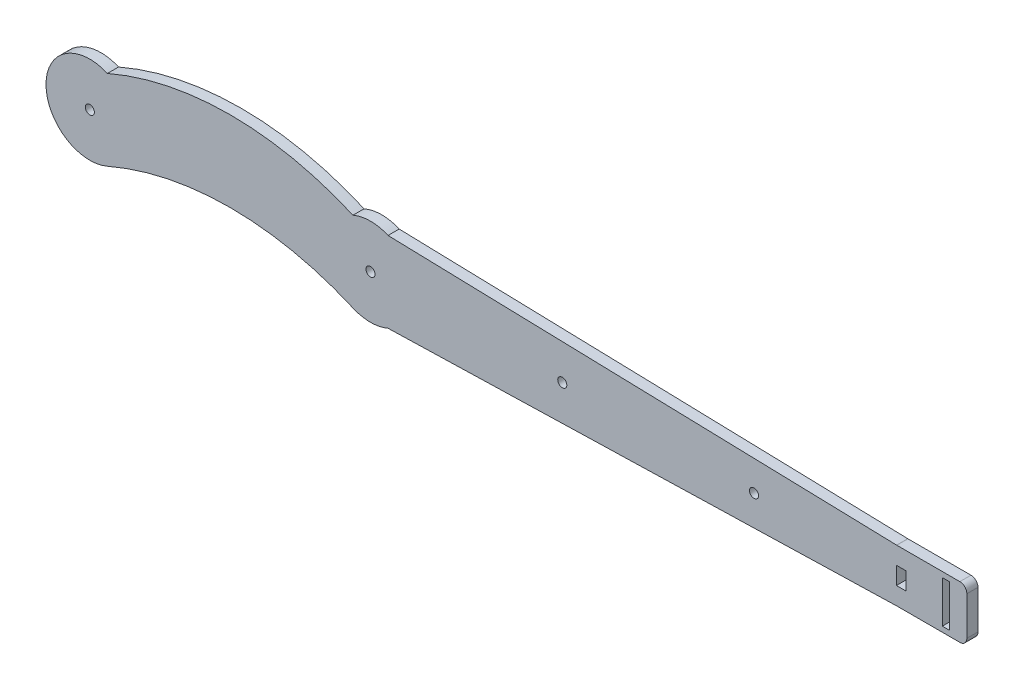
ISO-10303-21;
HEADER;
FILE_DESCRIPTION(('STEP AP214'),'2;1');
FILE_NAME('part.step','',(''),(''),'','','');
FILE_SCHEMA(('AUTOMOTIVE_DESIGN { 1 0 10303 214 1 1 1 1 }'));
ENDSEC;
DATA;
#1=APPLICATION_CONTEXT('core data for automotive mechanical design processes');
#2=APPLICATION_PROTOCOL_DEFINITION('international standard','automotive_design',2000,#1);
#3=PRODUCT_CONTEXT('',#1,'mechanical');
#4=PRODUCT('Part','Part','',(#3));
#5=PRODUCT_RELATED_PRODUCT_CATEGORY('part','',(#4));
#6=PRODUCT_DEFINITION_FORMATION('','',#4);
#7=PRODUCT_DEFINITION_CONTEXT('part definition',#1,'design');
#8=PRODUCT_DEFINITION('design','',#6,#7);
#9=PRODUCT_DEFINITION_SHAPE('','',#8);
#10=(LENGTH_UNIT() NAMED_UNIT(*) SI_UNIT(.MILLI.,.METRE.));
#11=(NAMED_UNIT(*) PLANE_ANGLE_UNIT() SI_UNIT($,.RADIAN.));
#12=(NAMED_UNIT(*) SI_UNIT($,.STERADIAN.) SOLID_ANGLE_UNIT());
#13=UNCERTAINTY_MEASURE_WITH_UNIT(LENGTH_MEASURE(1.E-05),#10,'distance_accuracy_value','');
#14=(GEOMETRIC_REPRESENTATION_CONTEXT(3) GLOBAL_UNCERTAINTY_ASSIGNED_CONTEXT((#13)) GLOBAL_UNIT_ASSIGNED_CONTEXT((#10,
#11,#12)) REPRESENTATION_CONTEXT('',''));
#15=CARTESIAN_POINT('',(0.,0.,0.));
#16=DIRECTION('',(0.,0.,1.));
#17=DIRECTION('',(1.,0.,0.));
#18=AXIS2_PLACEMENT_3D('',#15,#16,#17);
#19=CARTESIAN_POINT('',(150.,7.5,3.175));
#20=DIRECTION('',(0.,-1.,0.));
#21=DIRECTION('',(0.,0.,-1.));
#22=AXIS2_PLACEMENT_3D('',#19,#20,#21);
#23=PLANE('',#22);
#24=DIRECTION('',(-1.,0.,0.));
#25=VECTOR('',#24,1.);
#26=CARTESIAN_POINT('',(150.,7.5,0.));
#27=LINE('',#26,#25);
#28=CARTESIAN_POINT('',(168.,7.5,0.));
#29=VERTEX_POINT('',#28);
#30=CARTESIAN_POINT('',(150.027280711069,7.5,0.));
#31=VERTEX_POINT('',#30);
#32=EDGE_CURVE('E310',#29,#31,#27,.T.);
#33=ORIENTED_EDGE('',*,*,#32,.T.);
#34=DIRECTION('',(0.,0.,-1.));
#35=VECTOR('',#34,1.);
#36=CARTESIAN_POINT('',(150.027280711069,7.5,3.175));
#37=LINE('',#36,#35);
#38=CARTESIAN_POINT('',(150.027280711069,7.5,3.175));
#39=VERTEX_POINT('',#38);
#40=EDGE_CURVE('E363',#31,#39,#37,.F.);
#41=ORIENTED_EDGE('',*,*,#40,.T.);
#42=DIRECTION('',(-1.,0.,0.));
#43=VECTOR('',#42,1.);
#44=CARTESIAN_POINT('',(150.,7.5,3.175));
#45=LINE('',#44,#43);
#46=CARTESIAN_POINT('',(168.,7.5,3.175));
#47=VERTEX_POINT('',#46);
#48=EDGE_CURVE('E286',#47,#39,#45,.T.);
#49=ORIENTED_EDGE('',*,*,#48,.F.);
#50=DIRECTION('',(0.,0.,-1.));
#51=VECTOR('',#50,1.);
#52=CARTESIAN_POINT('',(168.,7.5,3.175));
#53=LINE('',#52,#51);
#54=EDGE_CURVE('E360',#47,#29,#53,.T.);
#55=ORIENTED_EDGE('',*,*,#54,.T.);
#56=EDGE_LOOP('',(#33,#41,#49,#55));
#57=FACE_BOUND('',#56,.T.);
#58=ADVANCED_FACE('F44',(#57),#23,.F.);
#59=CARTESIAN_POINT('',(150.,7.5,3.175));
#60=DIRECTION('',(-0.0272756361837529,-0.999627950625017,0.));
#61=DIRECTION('',(0.999627950625017,-0.0272756361837529,0.));
#62=AXIS2_PLACEMENT_3D('',#59,#60,#61);
#63=PLANE('',#62);
#64=DIRECTION('',(-0.999627950625017,0.0272756361837529,0.));
#65=VECTOR('',#64,1.);
#66=CARTESIAN_POINT('',(150.,7.5,3.175));
#67=LINE('',#66,#65);
#68=CARTESIAN_POINT('',(149.972729438702,7.50074409874996,3.175));
#69=VERTEX_POINT('',#68);
#70=CARTESIAN_POINT('',(5.,11.4564392373896,3.175));
#71=VERTEX_POINT('',#70);
#72=EDGE_CURVE('E289',#69,#71,#67,.T.);
#73=ORIENTED_EDGE('',*,*,#72,.F.);
#74=DIRECTION('',(0.,0.,-1.));
#75=VECTOR('',#74,1.);
#76=CARTESIAN_POINT('',(149.972729438702,7.50074409874996,0.));
#77=LINE('',#76,#75);
#78=CARTESIAN_POINT('',(149.972729438702,7.50074409874996,0.));
#79=VERTEX_POINT('',#78);
#80=EDGE_CURVE('E357',#69,#79,#77,.T.);
#81=ORIENTED_EDGE('',*,*,#80,.T.);
#82=DIRECTION('',(-0.999627950625017,0.0272756361837529,0.));
#83=VECTOR('',#82,1.);
#84=CARTESIAN_POINT('',(150.,7.5,0.));
#85=LINE('',#84,#83);
#86=CARTESIAN_POINT('',(5.,11.4564392373896,0.));
#87=VERTEX_POINT('',#86);
#88=EDGE_CURVE('E313',#79,#87,#85,.T.);
#89=ORIENTED_EDGE('',*,*,#88,.T.);
#90=DIRECTION('',(0.,0.,-1.));
#91=VECTOR('',#90,1.);
#92=CARTESIAN_POINT('',(5.,11.4564392373896,3.175));
#93=LINE('',#92,#91);
#94=EDGE_CURVE('E347',#71,#87,#93,.T.);
#95=ORIENTED_EDGE('',*,*,#94,.F.);
#96=EDGE_LOOP('',(#73,#81,#89,#95));
#97=FACE_BOUND('',#96,.T.);
#98=ADVANCED_FACE('F396',(#97),#63,.F.);
#99=CARTESIAN_POINT('',(0.,0.,3.175));
#100=DIRECTION('',(0.,0.,-1.));
#101=DIRECTION('',(-1.,0.,0.));
#102=AXIS2_PLACEMENT_3D('',#99,#100,#101);
#103=CYLINDRICAL_SURFACE('',#102,12.5);
#104=CARTESIAN_POINT('',(0.,0.,0.));
#105=DIRECTION('',(0.,0.,1.));
#106=DIRECTION('',(1.,0.,0.));
#107=AXIS2_PLACEMENT_3D('',#104,#105,#106);
#108=CIRCLE('',#107,12.5);
#109=CARTESIAN_POINT('',(-5.,11.4564392373896,0.));
#110=VERTEX_POINT('',#109);
#111=EDGE_CURVE('E316',#87,#110,#108,.T.);
#112=ORIENTED_EDGE('',*,*,#111,.T.);
#113=DIRECTION('',(0.,0.,-1.));
#114=VECTOR('',#113,1.);
#115=CARTESIAN_POINT('',(-5.,11.4564392373896,3.175));
#116=LINE('',#115,#114);
#117=CARTESIAN_POINT('',(-5.,11.4564392373896,3.175));
#118=VERTEX_POINT('',#117);
#119=EDGE_CURVE('E344',#118,#110,#116,.T.);
#120=ORIENTED_EDGE('',*,*,#119,.F.);
#121=CARTESIAN_POINT('',(0.,0.,3.175));
#122=DIRECTION('',(0.,0.,1.));
#123=DIRECTION('',(1.,0.,0.));
#124=AXIS2_PLACEMENT_3D('',#121,#122,#123);
#125=CIRCLE('',#124,12.5);
#126=EDGE_CURVE('E292',#71,#118,#125,.T.);
#127=ORIENTED_EDGE('',*,*,#126,.F.);
#128=ORIENTED_EDGE('',*,*,#94,.T.);
#129=EDGE_LOOP('',(#112,#120,#127,#128));
#130=FACE_BOUND('',#129,.T.);
#131=ADVANCED_FACE('F400',(#130),#103,.T.);
#132=CARTESIAN_POINT('',(-40.,-68.7386354243369,3.175));
#133=DIRECTION('',(0.,0.,-1.));
#134=DIRECTION('',(-1.,0.,0.));
#135=AXIS2_PLACEMENT_3D('',#132,#133,#134);
#136=CYLINDRICAL_SURFACE('',#135,87.4999999999994);
#137=CARTESIAN_POINT('',(-40.,-68.7386354243369,0.));
#138=DIRECTION('',(0.,0.,1.));
#139=DIRECTION('',(1.,0.,0.));
#140=AXIS2_PLACEMENT_3D('',#137,#138,#139);
#141=CIRCLE('',#140,87.4999999999994);
#142=CARTESIAN_POINT('',(-75.,11.4564392373896,0.));
#143=VERTEX_POINT('',#142);
#144=EDGE_CURVE('E318',#110,#143,#141,.T.);
#145=ORIENTED_EDGE('',*,*,#144,.T.);
#146=DIRECTION('',(0.,0.,-1.));
#147=VECTOR('',#146,1.);
#148=CARTESIAN_POINT('',(-75.,11.4564392373896,3.175));
#149=LINE('',#148,#147);
#150=CARTESIAN_POINT('',(-75.,11.4564392373896,3.175));
#151=VERTEX_POINT('',#150);
#152=EDGE_CURVE('E341',#151,#143,#149,.T.);
#153=ORIENTED_EDGE('',*,*,#152,.F.);
#154=CARTESIAN_POINT('',(-40.,-68.7386354243369,3.175));
#155=DIRECTION('',(0.,0.,1.));
#156=DIRECTION('',(1.,0.,0.));
#157=AXIS2_PLACEMENT_3D('',#154,#155,#156);
#158=CIRCLE('',#157,87.4999999999994);
#159=EDGE_CURVE('E294',#118,#151,#158,.T.);
#160=ORIENTED_EDGE('',*,*,#159,.F.);
#161=ORIENTED_EDGE('',*,*,#119,.T.);
#162=EDGE_LOOP('',(#145,#153,#160,#161));
#163=FACE_BOUND('',#162,.T.);
#164=ADVANCED_FACE('F406',(#163),#136,.T.);
#165=CARTESIAN_POINT('',(-80.,0.,3.175));
#166=DIRECTION('',(0.,0.,-1.));
#167=DIRECTION('',(-1.,0.,0.));
#168=AXIS2_PLACEMENT_3D('',#165,#166,#167);
#169=CYLINDRICAL_SURFACE('',#168,12.5);
#170=CARTESIAN_POINT('',(-80.,0.,0.));
#171=DIRECTION('',(0.,0.,1.));
#172=DIRECTION('',(1.,0.,0.));
#173=AXIS2_PLACEMENT_3D('',#170,#171,#172);
#174=CIRCLE('',#173,12.5);
#175=CARTESIAN_POINT('',(-75.,-11.4564392373896,0.));
#176=VERTEX_POINT('',#175);
#177=EDGE_CURVE('E320',#143,#176,#174,.T.);
#178=ORIENTED_EDGE('',*,*,#177,.T.);
#179=DIRECTION('',(0.,0.,-1.));
#180=VECTOR('',#179,1.);
#181=CARTESIAN_POINT('',(-75.,-11.4564392373896,3.175));
#182=LINE('',#181,#180);
#183=CARTESIAN_POINT('',(-75.,-11.4564392373896,3.175));
#184=VERTEX_POINT('',#183);
#185=EDGE_CURVE('E338',#184,#176,#182,.T.);
#186=ORIENTED_EDGE('',*,*,#185,.F.);
#187=CARTESIAN_POINT('',(-80.,0.,3.175));
#188=DIRECTION('',(0.,0.,1.));
#189=DIRECTION('',(1.,0.,0.));
#190=AXIS2_PLACEMENT_3D('',#187,#188,#189);
#191=CIRCLE('',#190,12.5);
#192=EDGE_CURVE('E296',#151,#184,#191,.T.);
#193=ORIENTED_EDGE('',*,*,#192,.F.);
#194=ORIENTED_EDGE('',*,*,#152,.T.);
#195=EDGE_LOOP('',(#178,#186,#193,#194));
#196=FACE_BOUND('',#195,.T.);
#197=ADVANCED_FACE('F410',(#196),#169,.T.);
#198=CARTESIAN_POINT('',(-40.,-91.6515138991167,3.175));
#199=DIRECTION('',(0.,0.,-1.));
#200=DIRECTION('',(-1.,0.,0.));
#201=AXIS2_PLACEMENT_3D('',#198,#199,#200);
#202=CYLINDRICAL_SURFACE('',#201,87.4999999999999);
#203=CARTESIAN_POINT('',(-40.,-91.6515138991167,0.));
#204=DIRECTION('',(0.,0.,-1.));
#205=DIRECTION('',(1.,0.,0.));
#206=AXIS2_PLACEMENT_3D('',#203,#204,#205);
#207=CIRCLE('',#206,87.4999999999999);
#208=CARTESIAN_POINT('',(-5.00000000000001,-11.4564392373896,0.));
#209=VERTEX_POINT('',#208);
#210=EDGE_CURVE('E322',#176,#209,#207,.T.);
#211=ORIENTED_EDGE('',*,*,#210,.T.);
#212=DIRECTION('',(0.,0.,-1.));
#213=VECTOR('',#212,1.);
#214=CARTESIAN_POINT('',(-5.00000000000001,-11.4564392373896,3.175));
#215=LINE('',#214,#213);
#216=CARTESIAN_POINT('',(-5.00000000000001,-11.4564392373896,3.175));
#217=VERTEX_POINT('',#216);
#218=EDGE_CURVE('E335',#217,#209,#215,.T.);
#219=ORIENTED_EDGE('',*,*,#218,.F.);
#220=CARTESIAN_POINT('',(-40.,-91.6515138991167,3.175));
#221=DIRECTION('',(0.,0.,-1.));
#222=DIRECTION('',(1.,0.,0.));
#223=AXIS2_PLACEMENT_3D('',#220,#221,#222);
#224=CIRCLE('',#223,87.4999999999999);
#225=EDGE_CURVE('E298',#184,#217,#224,.T.);
#226=ORIENTED_EDGE('',*,*,#225,.F.);
#227=ORIENTED_EDGE('',*,*,#185,.T.);
#228=EDGE_LOOP('',(#211,#219,#226,#227));
#229=FACE_BOUND('',#228,.T.);
#230=ADVANCED_FACE('F415',(#229),#202,.F.);
#231=CARTESIAN_POINT('',(0.,0.,3.175));
#232=DIRECTION('',(0.,0.,-1.));
#233=DIRECTION('',(-1.,0.,0.));
#234=AXIS2_PLACEMENT_3D('',#231,#232,#233);
#235=CYLINDRICAL_SURFACE('',#234,12.5);
#236=CARTESIAN_POINT('',(0.,0.,0.));
#237=DIRECTION('',(0.,0.,1.));
#238=DIRECTION('',(1.,0.,0.));
#239=AXIS2_PLACEMENT_3D('',#236,#237,#238);
#240=CIRCLE('',#239,12.5);
#241=CARTESIAN_POINT('',(5.,-11.4564392373896,0.));
#242=VERTEX_POINT('',#241);
#243=EDGE_CURVE('E324',#209,#242,#240,.T.);
#244=ORIENTED_EDGE('',*,*,#243,.T.);
#245=DIRECTION('',(0.,0.,-1.));
#246=VECTOR('',#245,1.);
#247=CARTESIAN_POINT('',(5.,-11.4564392373896,3.175));
#248=LINE('',#247,#246);
#249=CARTESIAN_POINT('',(5.,-11.4564392373896,3.175));
#250=VERTEX_POINT('',#249);
#251=EDGE_CURVE('E309',#250,#242,#248,.T.);
#252=ORIENTED_EDGE('',*,*,#251,.F.);
#253=CARTESIAN_POINT('',(0.,0.,3.175));
#254=DIRECTION('',(0.,0.,1.));
#255=DIRECTION('',(1.,0.,0.));
#256=AXIS2_PLACEMENT_3D('',#253,#254,#255);
#257=CIRCLE('',#256,12.5);
#258=EDGE_CURVE('E300',#217,#250,#257,.T.);
#259=ORIENTED_EDGE('',*,*,#258,.F.);
#260=ORIENTED_EDGE('',*,*,#218,.T.);
#261=EDGE_LOOP('',(#244,#252,#259,#260));
#262=FACE_BOUND('',#261,.T.);
#263=ADVANCED_FACE('F421',(#262),#235,.T.);
#264=CARTESIAN_POINT('',(5.,-11.4564392373896,3.175));
#265=DIRECTION('',(-0.0272756361837529,0.999627950625017,0.));
#266=DIRECTION('',(-0.999627950625017,-0.0272756361837529,0.));
#267=AXIS2_PLACEMENT_3D('',#264,#265,#266);
#268=PLANE('',#267);
#269=DIRECTION('',(0.999627950625017,0.0272756361837529,0.));
#270=VECTOR('',#269,1.);
#271=CARTESIAN_POINT('',(5.,-11.4564392373896,0.));
#272=LINE('',#271,#270);
#273=CARTESIAN_POINT('',(149.972729438702,-7.50074409874997,0.));
#274=VERTEX_POINT('',#273);
#275=EDGE_CURVE('E326',#242,#274,#272,.T.);
#276=ORIENTED_EDGE('',*,*,#275,.T.);
#277=DIRECTION('',(0.,0.,-1.));
#278=VECTOR('',#277,1.);
#279=CARTESIAN_POINT('',(149.972729438702,-7.50074409874996,3.175));
#280=LINE('',#279,#278);
#281=CARTESIAN_POINT('',(149.972729438702,-7.50074409874997,3.175));
#282=VERTEX_POINT('',#281);
#283=EDGE_CURVE('E355',#274,#282,#280,.F.);
#284=ORIENTED_EDGE('',*,*,#283,.T.);
#285=DIRECTION('',(0.999627950625017,0.0272756361837529,0.));
#286=VECTOR('',#285,1.);
#287=CARTESIAN_POINT('',(5.,-11.4564392373896,3.175));
#288=LINE('',#287,#286);
#289=EDGE_CURVE('E302',#250,#282,#288,.T.);
#290=ORIENTED_EDGE('',*,*,#289,.F.);
#291=ORIENTED_EDGE('',*,*,#251,.T.);
#292=EDGE_LOOP('',(#276,#284,#290,#291));
#293=FACE_BOUND('',#292,.T.);
#294=ADVANCED_FACE('F425',(#293),#268,.F.);
#295=CARTESIAN_POINT('',(170.,-7.5,3.175));
#296=DIRECTION('',(0.,1.,0.));
#297=DIRECTION('',(0.,0.,1.));
#298=AXIS2_PLACEMENT_3D('',#295,#296,#297);
#299=PLANE('',#298);
#300=DIRECTION('',(1.,0.,0.));
#301=VECTOR('',#300,1.);
#302=CARTESIAN_POINT('',(170.,-7.5,3.175));
#303=LINE('',#302,#301);
#304=CARTESIAN_POINT('',(150.027280711069,-7.5,3.175));
#305=VERTEX_POINT('',#304);
#306=CARTESIAN_POINT('',(168.,-7.5,3.175));
#307=VERTEX_POINT('',#306);
#308=EDGE_CURVE('E305',#305,#307,#303,.T.);
#309=ORIENTED_EDGE('',*,*,#308,.F.);
#310=DIRECTION('',(0.,0.,-1.));
#311=VECTOR('',#310,1.);
#312=CARTESIAN_POINT('',(150.027280711069,-7.5,0.));
#313=LINE('',#312,#311);
#314=CARTESIAN_POINT('',(150.027280711069,-7.5,0.));
#315=VERTEX_POINT('',#314);
#316=EDGE_CURVE('E352',#305,#315,#313,.T.);
#317=ORIENTED_EDGE('',*,*,#316,.T.);
#318=DIRECTION('',(1.,0.,0.));
#319=VECTOR('',#318,1.);
#320=CARTESIAN_POINT('',(170.,-7.5,0.));
#321=LINE('',#320,#319);
#322=CARTESIAN_POINT('',(168.,-7.5,0.));
#323=VERTEX_POINT('',#322);
#324=EDGE_CURVE('E329',#315,#323,#321,.T.);
#325=ORIENTED_EDGE('',*,*,#324,.T.);
#326=DIRECTION('',(0.,0.,-1.));
#327=VECTOR('',#326,1.);
#328=CARTESIAN_POINT('',(168.,-7.5,3.175));
#329=LINE('',#328,#327);
#330=EDGE_CURVE('E350',#323,#307,#329,.F.);
#331=ORIENTED_EDGE('',*,*,#330,.T.);
#332=EDGE_LOOP('',(#309,#317,#325,#331));
#333=FACE_BOUND('',#332,.T.);
#334=ADVANCED_FACE('F432',(#333),#299,.F.);
#335=CARTESIAN_POINT('',(170.,7.5,3.175));
#336=DIRECTION('',(-1.,0.,0.));
#337=DIRECTION('',(0.,0.,1.));
#338=AXIS2_PLACEMENT_3D('',#335,#336,#337);
#339=PLANE('',#338);
#340=DIRECTION('',(0.,1.,0.));
#341=VECTOR('',#340,1.);
#342=CARTESIAN_POINT('',(170.,7.5,3.175));
#343=LINE('',#342,#341);
#344=CARTESIAN_POINT('',(170.,-5.5,3.175));
#345=VERTEX_POINT('',#344);
#346=CARTESIAN_POINT('',(170.,5.5,3.175));
#347=VERTEX_POINT('',#346);
#348=EDGE_CURVE('E307',#345,#347,#343,.T.);
#349=ORIENTED_EDGE('',*,*,#348,.F.);
#350=DIRECTION('',(0.,0.,-1.));
#351=VECTOR('',#350,1.);
#352=CARTESIAN_POINT('',(170.,-5.5,3.175));
#353=LINE('',#352,#351);
#354=CARTESIAN_POINT('',(170.,-5.5,0.));
#355=VERTEX_POINT('',#354);
#356=EDGE_CURVE('E366',#345,#355,#353,.T.);
#357=ORIENTED_EDGE('',*,*,#356,.T.);
#358=DIRECTION('',(0.,1.,0.));
#359=VECTOR('',#358,1.);
#360=CARTESIAN_POINT('',(170.,7.5,0.));
#361=LINE('',#360,#359);
#362=CARTESIAN_POINT('',(170.,5.5,0.));
#363=VERTEX_POINT('',#362);
#364=EDGE_CURVE('E290',#355,#363,#361,.T.);
#365=ORIENTED_EDGE('',*,*,#364,.T.);
#366=DIRECTION('',(0.,0.,-1.));
#367=VECTOR('',#366,1.);
#368=CARTESIAN_POINT('',(170.,5.5,3.175));
#369=LINE('',#368,#367);
#370=EDGE_CURVE('E59',#363,#347,#369,.F.);
#371=ORIENTED_EDGE('',*,*,#370,.T.);
#372=EDGE_LOOP('',(#349,#357,#365,#371));
#373=FACE_BOUND('',#372,.T.);
#374=ADVANCED_FACE('F438',(#373),#339,.F.);
#375=CARTESIAN_POINT('',(0.,0.,3.175));
#376=DIRECTION('',(0.,0.,1.));
#377=DIRECTION('',(1.,0.,0.));
#378=AXIS2_PLACEMENT_3D('',#375,#376,#377);
#379=PLANE('',#378);
#380=CARTESIAN_POINT('',(-80.,0.,3.175));
#381=DIRECTION('',(0.,0.,1.));
#382=DIRECTION('',(1.,0.,0.));
#383=AXIS2_PLACEMENT_3D('',#380,#381,#382);
#384=CIRCLE('',#383,1.29250000000001);
#385=CARTESIAN_POINT('',(-78.7075,0.,3.175));
#386=VERTEX_POINT('',#385);
#387=EDGE_CURVE('E268',#386,#386,#384,.T.);
#388=ORIENTED_EDGE('',*,*,#387,.F.);
#389=EDGE_LOOP('',(#388));
#390=FACE_BOUND('',#389,.T.);
#391=DIRECTION('',(0.,-1.,0.));
#392=VECTOR('',#391,1.);
#393=CARTESIAN_POINT('',(163.,6.,3.175));
#394=LINE('',#393,#392);
#395=CARTESIAN_POINT('',(163.,6.,3.175));
#396=VERTEX_POINT('',#395);
#397=CARTESIAN_POINT('',(163.,-6.,3.175));
#398=VERTEX_POINT('',#397);
#399=EDGE_CURVE('E201',#396,#398,#394,.T.);
#400=ORIENTED_EDGE('',*,*,#399,.F.);
#401=DIRECTION('',(-1.,0.,0.));
#402=VECTOR('',#401,1.);
#403=CARTESIAN_POINT('',(163.,6.,3.175));
#404=LINE('',#403,#402);
#405=CARTESIAN_POINT('',(165.,6.,3.175));
#406=VERTEX_POINT('',#405);
#407=EDGE_CURVE('E219',#406,#396,#404,.T.);
#408=ORIENTED_EDGE('',*,*,#407,.F.);
#409=DIRECTION('',(0.,1.,0.));
#410=VECTOR('',#409,1.);
#411=CARTESIAN_POINT('',(165.,6.,3.175));
#412=LINE('',#411,#410);
#413=CARTESIAN_POINT('',(165.,-6.,3.175));
#414=VERTEX_POINT('',#413);
#415=EDGE_CURVE('E222',#414,#406,#412,.T.);
#416=ORIENTED_EDGE('',*,*,#415,.F.);
#417=DIRECTION('',(1.,0.,0.));
#418=VECTOR('',#417,1.);
#419=CARTESIAN_POINT('',(163.,-6.,3.175));
#420=LINE('',#419,#418);
#421=EDGE_CURVE('E231',#398,#414,#420,.T.);
#422=ORIENTED_EDGE('',*,*,#421,.F.);
#423=EDGE_LOOP('',(#400,#408,#416,#422));
#424=FACE_BOUND('',#423,.T.);
#425=CARTESIAN_POINT('',(109.333333333333,0.,3.175));
#426=DIRECTION('',(0.,0.,1.));
#427=DIRECTION('',(1.,0.,0.));
#428=AXIS2_PLACEMENT_3D('',#425,#426,#427);
#429=CIRCLE('',#428,1.29250000000001);
#430=CARTESIAN_POINT('',(110.625833333333,0.,3.175));
#431=VERTEX_POINT('',#430);
#432=EDGE_CURVE('E225',#431,#431,#429,.T.);
#433=ORIENTED_EDGE('',*,*,#432,.F.);
#434=EDGE_LOOP('',(#433));
#435=FACE_BOUND('',#434,.T.);
#436=CARTESIAN_POINT('',(54.6666666666667,0.,3.175));
#437=DIRECTION('',(0.,0.,1.));
#438=DIRECTION('',(1.,0.,0.));
#439=AXIS2_PLACEMENT_3D('',#436,#437,#438);
#440=CIRCLE('',#439,1.2925);
#441=CARTESIAN_POINT('',(55.9591666666667,0.,3.175));
#442=VERTEX_POINT('',#441);
#443=EDGE_CURVE('E277',#442,#442,#440,.T.);
#444=ORIENTED_EDGE('',*,*,#443,.F.);
#445=EDGE_LOOP('',(#444));
#446=FACE_BOUND('',#445,.T.);
#447=DIRECTION('',(0.,-1.,0.));
#448=VECTOR('',#447,1.);
#449=CARTESIAN_POINT('',(149.925,2.5,3.175));
#450=LINE('',#449,#448);
#451=CARTESIAN_POINT('',(149.925,2.5,3.175));
#452=VERTEX_POINT('',#451);
#453=CARTESIAN_POINT('',(149.925,-2.5,3.175));
#454=VERTEX_POINT('',#453);
#455=EDGE_CURVE('E255',#452,#454,#450,.T.);
#456=ORIENTED_EDGE('',*,*,#455,.F.);
#457=DIRECTION('',(-1.,0.,0.));
#458=VECTOR('',#457,1.);
#459=CARTESIAN_POINT('',(149.925,2.5,3.175));
#460=LINE('',#459,#458);
#461=CARTESIAN_POINT('',(152.675,2.5,3.175));
#462=VERTEX_POINT('',#461);
#463=EDGE_CURVE('E245',#462,#452,#460,.T.);
#464=ORIENTED_EDGE('',*,*,#463,.F.);
#465=DIRECTION('',(0.,1.,0.));
#466=VECTOR('',#465,1.);
#467=CARTESIAN_POINT('',(152.675,2.5,3.175));
#468=LINE('',#467,#466);
#469=CARTESIAN_POINT('',(152.675,-2.5,3.175));
#470=VERTEX_POINT('',#469);
#471=EDGE_CURVE('E261',#470,#462,#468,.T.);
#472=ORIENTED_EDGE('',*,*,#471,.F.);
#473=DIRECTION('',(1.,0.,0.));
#474=VECTOR('',#473,1.);
#475=CARTESIAN_POINT('',(149.925,-2.5,3.175));
#476=LINE('',#475,#474);
#477=EDGE_CURVE('E257',#454,#470,#476,.T.);
#478=ORIENTED_EDGE('',*,*,#477,.F.);
#479=EDGE_LOOP('',(#456,#464,#472,#478));
#480=FACE_BOUND('',#479,.T.);
#481=CARTESIAN_POINT('',(0.,0.,3.175));
#482=DIRECTION('',(0.,0.,1.));
#483=DIRECTION('',(1.,0.,0.));
#484=AXIS2_PLACEMENT_3D('',#481,#482,#483);
#485=CIRCLE('',#484,1.2925);
#486=CARTESIAN_POINT('',(1.2925,0.,3.175));
#487=VERTEX_POINT('',#486);
#488=EDGE_CURVE('E283',#487,#487,#485,.T.);
#489=ORIENTED_EDGE('',*,*,#488,.F.);
#490=EDGE_LOOP('',(#489));
#491=FACE_BOUND('',#490,.T.);
#492=ORIENTED_EDGE('',*,*,#308,.T.);
#493=CARTESIAN_POINT('',(168.,-5.5,3.175));
#494=DIRECTION('',(0.,0.,1.));
#495=DIRECTION('',(1.,0.,0.));
#496=AXIS2_PLACEMENT_3D('',#493,#494,#495);
#497=CIRCLE('',#496,2.);
#498=EDGE_CURVE('E66',#307,#345,#497,.T.);
#499=ORIENTED_EDGE('',*,*,#498,.T.);
#500=ORIENTED_EDGE('',*,*,#348,.T.);
#501=CARTESIAN_POINT('',(168.,5.5,3.175));
#502=DIRECTION('',(0.,0.,1.));
#503=DIRECTION('',(1.,0.,0.));
#504=AXIS2_PLACEMENT_3D('',#501,#502,#503);
#505=CIRCLE('',#504,2.);
#506=EDGE_CURVE('E373',#347,#47,#505,.T.);
#507=ORIENTED_EDGE('',*,*,#506,.T.);
#508=ORIENTED_EDGE('',*,*,#48,.T.);
#509=CARTESIAN_POINT('',(150.027280711069,9.5,3.175));
#510=DIRECTION('',(0.,0.,1.));
#511=DIRECTION('',(1.,0.,0.));
#512=AXIS2_PLACEMENT_3D('',#509,#510,#511);
#513=CIRCLE('',#512,2.);
#514=EDGE_CURVE('E13',#39,#69,#513,.F.);
#515=ORIENTED_EDGE('',*,*,#514,.T.);
#516=ORIENTED_EDGE('',*,*,#72,.T.);
#517=ORIENTED_EDGE('',*,*,#126,.T.);
#518=ORIENTED_EDGE('',*,*,#159,.T.);
#519=ORIENTED_EDGE('',*,*,#192,.T.);
#520=ORIENTED_EDGE('',*,*,#225,.T.);
#521=ORIENTED_EDGE('',*,*,#258,.T.);
#522=ORIENTED_EDGE('',*,*,#289,.T.);
#523=CARTESIAN_POINT('',(150.027280711069,-9.5,3.175));
#524=DIRECTION('',(0.,0.,1.));
#525=DIRECTION('',(1.,0.,0.));
#526=AXIS2_PLACEMENT_3D('',#523,#524,#525);
#527=CIRCLE('',#526,2.);
#528=EDGE_CURVE('E378',#282,#305,#527,.F.);
#529=ORIENTED_EDGE('',*,*,#528,.T.);
#530=EDGE_LOOP('',(#492,#499,#500,#507,#508,#515,#516,#517,#518,#519,#520,#521,#522,#529));
#531=FACE_BOUND('',#530,.T.);
#532=ADVANCED_FACE('F393',(#390,#424,#435,#446,#480,#491,#531),#379,.T.);
#533=CARTESIAN_POINT('',(0.,0.,0.));
#534=DIRECTION('',(0.,0.,1.));
#535=DIRECTION('',(1.,0.,0.));
#536=AXIS2_PLACEMENT_3D('',#533,#534,#535);
#537=PLANE('',#536);
#538=CARTESIAN_POINT('',(-80.,0.,0.));
#539=DIRECTION('',(0.,0.,1.));
#540=DIRECTION('',(1.,0.,0.));
#541=AXIS2_PLACEMENT_3D('',#538,#539,#540);
#542=CIRCLE('',#541,1.29250000000001);
#543=CARTESIAN_POINT('',(-78.7075,0.,0.));
#544=VERTEX_POINT('',#543);
#545=EDGE_CURVE('E314',#544,#544,#542,.T.);
#546=ORIENTED_EDGE('',*,*,#545,.T.);
#547=EDGE_LOOP('',(#546));
#548=FACE_BOUND('',#547,.T.);
#549=DIRECTION('',(-1.,0.,0.));
#550=VECTOR('',#549,1.);
#551=CARTESIAN_POINT('',(163.,6.,0.));
#552=LINE('',#551,#550);
#553=CARTESIAN_POINT('',(165.,6.,0.));
#554=VERTEX_POINT('',#553);
#555=CARTESIAN_POINT('',(163.,6.,0.));
#556=VERTEX_POINT('',#555);
#557=EDGE_CURVE('E206',#554,#556,#552,.T.);
#558=ORIENTED_EDGE('',*,*,#557,.T.);
#559=DIRECTION('',(0.,-1.,0.));
#560=VECTOR('',#559,1.);
#561=CARTESIAN_POINT('',(163.,6.,0.));
#562=LINE('',#561,#560);
#563=CARTESIAN_POINT('',(163.,-6.,0.));
#564=VERTEX_POINT('',#563);
#565=EDGE_CURVE('E198',#556,#564,#562,.T.);
#566=ORIENTED_EDGE('',*,*,#565,.T.);
#567=DIRECTION('',(1.,0.,0.));
#568=VECTOR('',#567,1.);
#569=CARTESIAN_POINT('',(163.,-6.,0.));
#570=LINE('',#569,#568);
#571=CARTESIAN_POINT('',(165.,-6.,0.));
#572=VERTEX_POINT('',#571);
#573=EDGE_CURVE('E210',#564,#572,#570,.T.);
#574=ORIENTED_EDGE('',*,*,#573,.T.);
#575=DIRECTION('',(0.,1.,0.));
#576=VECTOR('',#575,1.);
#577=CARTESIAN_POINT('',(165.,6.,0.));
#578=LINE('',#577,#576);
#579=EDGE_CURVE('E214',#572,#554,#578,.T.);
#580=ORIENTED_EDGE('',*,*,#579,.T.);
#581=EDGE_LOOP('',(#558,#566,#574,#580));
#582=FACE_BOUND('',#581,.T.);
#583=CARTESIAN_POINT('',(109.333333333333,0.,0.));
#584=DIRECTION('',(0.,0.,1.));
#585=DIRECTION('',(1.,0.,0.));
#586=AXIS2_PLACEMENT_3D('',#583,#584,#585);
#587=CIRCLE('',#586,1.29250000000001);
#588=CARTESIAN_POINT('',(110.625833333333,0.,0.));
#589=VERTEX_POINT('',#588);
#590=EDGE_CURVE('E280',#589,#589,#587,.T.);
#591=ORIENTED_EDGE('',*,*,#590,.T.);
#592=EDGE_LOOP('',(#591));
#593=FACE_BOUND('',#592,.T.);
#594=CARTESIAN_POINT('',(54.6666666666667,0.,0.));
#595=DIRECTION('',(0.,0.,1.));
#596=DIRECTION('',(1.,0.,0.));
#597=AXIS2_PLACEMENT_3D('',#594,#595,#596);
#598=CIRCLE('',#597,1.2925);
#599=CARTESIAN_POINT('',(55.9591666666667,0.,0.));
#600=VERTEX_POINT('',#599);
#601=EDGE_CURVE('E258',#600,#600,#598,.T.);
#602=ORIENTED_EDGE('',*,*,#601,.T.);
#603=EDGE_LOOP('',(#602));
#604=FACE_BOUND('',#603,.T.);
#605=DIRECTION('',(-1.,0.,0.));
#606=VECTOR('',#605,1.);
#607=CARTESIAN_POINT('',(149.925,2.5,0.));
#608=LINE('',#607,#606);
#609=CARTESIAN_POINT('',(152.675,2.5,0.));
#610=VERTEX_POINT('',#609);
#611=CARTESIAN_POINT('',(149.925,2.5,0.));
#612=VERTEX_POINT('',#611);
#613=EDGE_CURVE('E251',#610,#612,#608,.T.);
#614=ORIENTED_EDGE('',*,*,#613,.T.);
#615=DIRECTION('',(0.,-1.,0.));
#616=VECTOR('',#615,1.);
#617=CARTESIAN_POINT('',(149.925,2.5,0.));
#618=LINE('',#617,#616);
#619=CARTESIAN_POINT('',(149.925,-2.5,0.));
#620=VERTEX_POINT('',#619);
#621=EDGE_CURVE('E241',#612,#620,#618,.T.);
#622=ORIENTED_EDGE('',*,*,#621,.T.);
#623=DIRECTION('',(1.,0.,0.));
#624=VECTOR('',#623,1.);
#625=CARTESIAN_POINT('',(149.925,-2.5,0.));
#626=LINE('',#625,#624);
#627=CARTESIAN_POINT('',(152.675,-2.5,0.));
#628=VERTEX_POINT('',#627);
#629=EDGE_CURVE('E244',#620,#628,#626,.T.);
#630=ORIENTED_EDGE('',*,*,#629,.T.);
#631=DIRECTION('',(0.,1.,0.));
#632=VECTOR('',#631,1.);
#633=CARTESIAN_POINT('',(152.675,2.5,0.));
#634=LINE('',#633,#632);
#635=EDGE_CURVE('E248',#628,#610,#634,.T.);
#636=ORIENTED_EDGE('',*,*,#635,.T.);
#637=EDGE_LOOP('',(#614,#622,#630,#636));
#638=FACE_BOUND('',#637,.T.);
#639=CARTESIAN_POINT('',(0.,0.,0.));
#640=DIRECTION('',(0.,0.,1.));
#641=DIRECTION('',(1.,0.,0.));
#642=AXIS2_PLACEMENT_3D('',#639,#640,#641);
#643=CIRCLE('',#642,1.2925);
#644=CARTESIAN_POINT('',(1.2925,0.,0.));
#645=VERTEX_POINT('',#644);
#646=EDGE_CURVE('E232',#645,#645,#643,.T.);
#647=ORIENTED_EDGE('',*,*,#646,.T.);
#648=EDGE_LOOP('',(#647));
#649=FACE_BOUND('',#648,.T.);
#650=ORIENTED_EDGE('',*,*,#364,.F.);
#651=CARTESIAN_POINT('',(168.,-5.5,0.));
#652=DIRECTION('',(0.,0.,1.));
#653=DIRECTION('',(1.,0.,0.));
#654=AXIS2_PLACEMENT_3D('',#651,#652,#653);
#655=CIRCLE('',#654,2.);
#656=EDGE_CURVE('E371',#355,#323,#655,.F.);
#657=ORIENTED_EDGE('',*,*,#656,.T.);
#658=ORIENTED_EDGE('',*,*,#324,.F.);
#659=CARTESIAN_POINT('',(150.027280711069,-9.5,0.));
#660=DIRECTION('',(0.,0.,1.));
#661=DIRECTION('',(1.,0.,0.));
#662=AXIS2_PLACEMENT_3D('',#659,#660,#661);
#663=CIRCLE('',#662,2.);
#664=EDGE_CURVE('E376',#315,#274,#663,.T.);
#665=ORIENTED_EDGE('',*,*,#664,.T.);
#666=ORIENTED_EDGE('',*,*,#275,.F.);
#667=ORIENTED_EDGE('',*,*,#243,.F.);
#668=ORIENTED_EDGE('',*,*,#210,.F.);
#669=ORIENTED_EDGE('',*,*,#177,.F.);
#670=ORIENTED_EDGE('',*,*,#144,.F.);
#671=ORIENTED_EDGE('',*,*,#111,.F.);
#672=ORIENTED_EDGE('',*,*,#88,.F.);
#673=CARTESIAN_POINT('',(150.027280711069,9.5,0.));
#674=DIRECTION('',(0.,0.,1.));
#675=DIRECTION('',(1.,0.,0.));
#676=AXIS2_PLACEMENT_3D('',#673,#674,#675);
#677=CIRCLE('',#676,2.);
#678=EDGE_CURVE('E52',#79,#31,#677,.T.);
#679=ORIENTED_EDGE('',*,*,#678,.T.);
#680=ORIENTED_EDGE('',*,*,#32,.F.);
#681=CARTESIAN_POINT('',(168.,5.5,0.));
#682=DIRECTION('',(0.,0.,1.));
#683=DIRECTION('',(1.,0.,0.));
#684=AXIS2_PLACEMENT_3D('',#681,#682,#683);
#685=CIRCLE('',#684,2.);
#686=EDGE_CURVE('E369',#29,#363,#685,.F.);
#687=ORIENTED_EDGE('',*,*,#686,.T.);
#688=EDGE_LOOP('',(#650,#657,#658,#665,#666,#667,#668,#669,#670,#671,#672,#679,#680,#687));
#689=FACE_BOUND('',#688,.T.);
#690=ADVANCED_FACE('F216',(#548,#582,#593,#604,#638,#649,#689),#537,.F.);
#691=CARTESIAN_POINT('',(0.,0.,0.));
#692=DIRECTION('',(0.,0.,1.));
#693=DIRECTION('',(1.,0.,0.));
#694=AXIS2_PLACEMENT_3D('',#691,#692,#693);
#695=CYLINDRICAL_SURFACE('',#694,1.2925);
#696=ORIENTED_EDGE('',*,*,#646,.F.);
#697=EDGE_LOOP('',(#696));
#698=FACE_BOUND('',#697,.T.);
#699=ORIENTED_EDGE('',*,*,#488,.T.);
#700=EDGE_LOOP('',(#699));
#701=FACE_BOUND('',#700,.T.);
#702=ADVANCED_FACE('F572',(#698,#701),#695,.F.);
#703=CARTESIAN_POINT('',(149.925,2.5,0.));
#704=DIRECTION('',(-1.,0.,0.));
#705=DIRECTION('',(0.,0.,1.));
#706=AXIS2_PLACEMENT_3D('',#703,#704,#705);
#707=PLANE('',#706);
#708=ORIENTED_EDGE('',*,*,#455,.T.);
#709=DIRECTION('',(0.,0.,1.));
#710=VECTOR('',#709,1.);
#711=CARTESIAN_POINT('',(149.925,-2.5,0.));
#712=LINE('',#711,#710);
#713=EDGE_CURVE('E254',#620,#454,#712,.T.);
#714=ORIENTED_EDGE('',*,*,#713,.F.);
#715=ORIENTED_EDGE('',*,*,#621,.F.);
#716=DIRECTION('',(0.,0.,1.));
#717=VECTOR('',#716,1.);
#718=CARTESIAN_POINT('',(149.925,2.5,0.));
#719=LINE('',#718,#717);
#720=EDGE_CURVE('E266',#612,#452,#719,.T.);
#721=ORIENTED_EDGE('',*,*,#720,.T.);
#722=EDGE_LOOP('',(#708,#714,#715,#721));
#723=FACE_BOUND('',#722,.T.);
#724=ADVANCED_FACE('F563',(#723),#707,.F.);
#725=CARTESIAN_POINT('',(149.925,2.5,0.));
#726=DIRECTION('',(0.,1.,0.));
#727=DIRECTION('',(0.,0.,1.));
#728=AXIS2_PLACEMENT_3D('',#725,#726,#727);
#729=PLANE('',#728);
#730=ORIENTED_EDGE('',*,*,#463,.T.);
#731=ORIENTED_EDGE('',*,*,#720,.F.);
#732=ORIENTED_EDGE('',*,*,#613,.F.);
#733=DIRECTION('',(0.,0.,1.));
#734=VECTOR('',#733,1.);
#735=CARTESIAN_POINT('',(152.675,2.5,0.));
#736=LINE('',#735,#734);
#737=EDGE_CURVE('E269',#610,#462,#736,.T.);
#738=ORIENTED_EDGE('',*,*,#737,.T.);
#739=EDGE_LOOP('',(#730,#731,#732,#738));
#740=FACE_BOUND('',#739,.T.);
#741=ADVANCED_FACE('F554',(#740),#729,.F.);
#742=CARTESIAN_POINT('',(152.675,2.5,0.));
#743=DIRECTION('',(1.,0.,0.));
#744=DIRECTION('',(0.,0.,-1.));
#745=AXIS2_PLACEMENT_3D('',#742,#743,#744);
#746=PLANE('',#745);
#747=ORIENTED_EDGE('',*,*,#471,.T.);
#748=ORIENTED_EDGE('',*,*,#737,.F.);
#749=ORIENTED_EDGE('',*,*,#635,.F.);
#750=DIRECTION('',(0.,0.,1.));
#751=VECTOR('',#750,1.);
#752=CARTESIAN_POINT('',(152.675,-2.5,0.));
#753=LINE('',#752,#751);
#754=EDGE_CURVE('E271',#628,#470,#753,.T.);
#755=ORIENTED_EDGE('',*,*,#754,.T.);
#756=EDGE_LOOP('',(#747,#748,#749,#755));
#757=FACE_BOUND('',#756,.T.);
#758=ADVANCED_FACE('F545',(#757),#746,.F.);
#759=CARTESIAN_POINT('',(149.925,-2.5,0.));
#760=DIRECTION('',(0.,-1.,0.));
#761=DIRECTION('',(1.,0.,0.));
#762=AXIS2_PLACEMENT_3D('',#759,#760,#761);
#763=PLANE('',#762);
#764=ORIENTED_EDGE('',*,*,#477,.T.);
#765=ORIENTED_EDGE('',*,*,#754,.F.);
#766=ORIENTED_EDGE('',*,*,#629,.F.);
#767=ORIENTED_EDGE('',*,*,#713,.T.);
#768=EDGE_LOOP('',(#764,#765,#766,#767));
#769=FACE_BOUND('',#768,.T.);
#770=ADVANCED_FACE('F536',(#769),#763,.F.);
#771=CARTESIAN_POINT('',(54.6666666666667,0.,0.));
#772=DIRECTION('',(0.,0.,1.));
#773=DIRECTION('',(1.,0.,0.));
#774=AXIS2_PLACEMENT_3D('',#771,#772,#773);
#775=CYLINDRICAL_SURFACE('',#774,1.2925);
#776=ORIENTED_EDGE('',*,*,#601,.F.);
#777=EDGE_LOOP('',(#776));
#778=FACE_BOUND('',#777,.T.);
#779=ORIENTED_EDGE('',*,*,#443,.T.);
#780=EDGE_LOOP('',(#779));
#781=FACE_BOUND('',#780,.T.);
#782=ADVANCED_FACE('F527',(#778,#781),#775,.F.);
#783=CARTESIAN_POINT('',(109.333333333333,0.,0.));
#784=DIRECTION('',(0.,0.,1.));
#785=DIRECTION('',(1.,0.,0.));
#786=AXIS2_PLACEMENT_3D('',#783,#784,#785);
#787=CYLINDRICAL_SURFACE('',#786,1.29250000000001);
#788=ORIENTED_EDGE('',*,*,#590,.F.);
#789=EDGE_LOOP('',(#788));
#790=FACE_BOUND('',#789,.T.);
#791=ORIENTED_EDGE('',*,*,#432,.T.);
#792=EDGE_LOOP('',(#791));
#793=FACE_BOUND('',#792,.T.);
#794=ADVANCED_FACE('F519',(#790,#793),#787,.F.);
#795=CARTESIAN_POINT('',(163.,6.,0.));
#796=DIRECTION('',(-1.,0.,0.));
#797=DIRECTION('',(0.,0.,1.));
#798=AXIS2_PLACEMENT_3D('',#795,#796,#797);
#799=PLANE('',#798);
#800=ORIENTED_EDGE('',*,*,#399,.T.);
#801=DIRECTION('',(0.,0.,1.));
#802=VECTOR('',#801,1.);
#803=CARTESIAN_POINT('',(163.,-6.,0.));
#804=LINE('',#803,#802);
#805=EDGE_CURVE('E194',#564,#398,#804,.T.);
#806=ORIENTED_EDGE('',*,*,#805,.F.);
#807=ORIENTED_EDGE('',*,*,#565,.F.);
#808=DIRECTION('',(0.,0.,1.));
#809=VECTOR('',#808,1.);
#810=CARTESIAN_POINT('',(163.,6.,0.));
#811=LINE('',#810,#809);
#812=EDGE_CURVE('E236',#556,#396,#811,.T.);
#813=ORIENTED_EDGE('',*,*,#812,.T.);
#814=EDGE_LOOP('',(#800,#806,#807,#813));
#815=FACE_BOUND('',#814,.T.);
#816=ADVANCED_FACE('F196',(#815),#799,.F.);
#817=CARTESIAN_POINT('',(163.,6.,0.));
#818=DIRECTION('',(0.,1.,0.));
#819=DIRECTION('',(0.,0.,1.));
#820=AXIS2_PLACEMENT_3D('',#817,#818,#819);
#821=PLANE('',#820);
#822=ORIENTED_EDGE('',*,*,#407,.T.);
#823=ORIENTED_EDGE('',*,*,#812,.F.);
#824=ORIENTED_EDGE('',*,*,#557,.F.);
#825=DIRECTION('',(0.,0.,1.));
#826=VECTOR('',#825,1.);
#827=CARTESIAN_POINT('',(165.,6.,0.));
#828=LINE('',#827,#826);
#829=EDGE_CURVE('E238',#554,#406,#828,.T.);
#830=ORIENTED_EDGE('',*,*,#829,.T.);
#831=EDGE_LOOP('',(#822,#823,#824,#830));
#832=FACE_BOUND('',#831,.T.);
#833=ADVANCED_FACE('F502',(#832),#821,.F.);
#834=CARTESIAN_POINT('',(165.,6.,0.));
#835=DIRECTION('',(1.,0.,0.));
#836=DIRECTION('',(0.,0.,-1.));
#837=AXIS2_PLACEMENT_3D('',#834,#835,#836);
#838=PLANE('',#837);
#839=ORIENTED_EDGE('',*,*,#415,.T.);
#840=ORIENTED_EDGE('',*,*,#829,.F.);
#841=ORIENTED_EDGE('',*,*,#579,.F.);
#842=DIRECTION('',(0.,0.,1.));
#843=VECTOR('',#842,1.);
#844=CARTESIAN_POINT('',(165.,-6.,0.));
#845=LINE('',#844,#843);
#846=EDGE_CURVE('E205',#572,#414,#845,.T.);
#847=ORIENTED_EDGE('',*,*,#846,.T.);
#848=EDGE_LOOP('',(#839,#840,#841,#847));
#849=FACE_BOUND('',#848,.T.);
#850=ADVANCED_FACE('F494',(#849),#838,.F.);
#851=CARTESIAN_POINT('',(163.,-6.,0.));
#852=DIRECTION('',(0.,-1.,0.));
#853=DIRECTION('',(0.,0.,-1.));
#854=AXIS2_PLACEMENT_3D('',#851,#852,#853);
#855=PLANE('',#854);
#856=ORIENTED_EDGE('',*,*,#421,.T.);
#857=ORIENTED_EDGE('',*,*,#846,.F.);
#858=ORIENTED_EDGE('',*,*,#573,.F.);
#859=ORIENTED_EDGE('',*,*,#805,.T.);
#860=EDGE_LOOP('',(#856,#857,#858,#859));
#861=FACE_BOUND('',#860,.T.);
#862=ADVANCED_FACE('F211',(#861),#855,.F.);
#863=CARTESIAN_POINT('',(-80.,0.,0.));
#864=DIRECTION('',(0.,0.,1.));
#865=DIRECTION('',(1.,0.,0.));
#866=AXIS2_PLACEMENT_3D('',#863,#864,#865);
#867=CYLINDRICAL_SURFACE('',#866,1.29250000000001);
#868=ORIENTED_EDGE('',*,*,#545,.F.);
#869=EDGE_LOOP('',(#868));
#870=FACE_BOUND('',#869,.T.);
#871=ORIENTED_EDGE('',*,*,#387,.T.);
#872=EDGE_LOOP('',(#871));
#873=FACE_BOUND('',#872,.T.);
#874=ADVANCED_FACE('F455',(#870,#873),#867,.F.);
#875=CARTESIAN_POINT('',(150.027280711069,-9.5,3.175));
#876=DIRECTION('',(0.,0.,1.));
#877=DIRECTION('',(1.,0.,0.));
#878=AXIS2_PLACEMENT_3D('',#875,#876,#877);
#879=CYLINDRICAL_SURFACE('',#878,2.);
#880=ORIENTED_EDGE('',*,*,#528,.F.);
#881=ORIENTED_EDGE('',*,*,#283,.F.);
#882=ORIENTED_EDGE('',*,*,#664,.F.);
#883=ORIENTED_EDGE('',*,*,#316,.F.);
#884=EDGE_LOOP('',(#880,#881,#882,#883));
#885=FACE_BOUND('',#884,.T.);
#886=ADVANCED_FACE('F428',(#885),#879,.F.);
#887=CARTESIAN_POINT('',(150.027280711069,9.5,3.175));
#888=DIRECTION('',(0.,0.,1.));
#889=DIRECTION('',(1.,0.,0.));
#890=AXIS2_PLACEMENT_3D('',#887,#888,#889);
#891=CYLINDRICAL_SURFACE('',#890,2.);
#892=ORIENTED_EDGE('',*,*,#514,.F.);
#893=ORIENTED_EDGE('',*,*,#40,.F.);
#894=ORIENTED_EDGE('',*,*,#678,.F.);
#895=ORIENTED_EDGE('',*,*,#80,.F.);
#896=EDGE_LOOP('',(#892,#893,#894,#895));
#897=FACE_BOUND('',#896,.T.);
#898=ADVANCED_FACE('F391',(#897),#891,.F.);
#899=CARTESIAN_POINT('',(168.,-5.5,3.175));
#900=DIRECTION('',(0.,0.,-1.));
#901=DIRECTION('',(-1.,0.,0.));
#902=AXIS2_PLACEMENT_3D('',#899,#900,#901);
#903=CYLINDRICAL_SURFACE('',#902,2.);
#904=ORIENTED_EDGE('',*,*,#498,.F.);
#905=ORIENTED_EDGE('',*,*,#330,.F.);
#906=ORIENTED_EDGE('',*,*,#656,.F.);
#907=ORIENTED_EDGE('',*,*,#356,.F.);
#908=EDGE_LOOP('',(#904,#905,#906,#907));
#909=FACE_BOUND('',#908,.T.);
#910=ADVANCED_FACE('F436',(#909),#903,.T.);
#911=CARTESIAN_POINT('',(168.,5.5,3.175));
#912=DIRECTION('',(0.,0.,-1.));
#913=DIRECTION('',(-1.,0.,0.));
#914=AXIS2_PLACEMENT_3D('',#911,#912,#913);
#915=CYLINDRICAL_SURFACE('',#914,2.);
#916=ORIENTED_EDGE('',*,*,#506,.F.);
#917=ORIENTED_EDGE('',*,*,#370,.F.);
#918=ORIENTED_EDGE('',*,*,#686,.F.);
#919=ORIENTED_EDGE('',*,*,#54,.F.);
#920=EDGE_LOOP('',(#916,#917,#918,#919));
#921=FACE_BOUND('',#920,.T.);
#922=ADVANCED_FACE('F46',(#921),#915,.T.);
#923=CLOSED_SHELL('',(#58,#98,#131,#164,#197,#230,#263,#294,#334,#374,#532,#690,#702,#724,#741,
#758,#770,#782,#794,#816,#833,#850,#862,#874,#886,#898,#910,#922));
#924=MANIFOLD_SOLID_BREP('B2',#923);
#925=ADVANCED_BREP_SHAPE_REPRESENTATION('',(#18,#924),#14);
#926=SHAPE_DEFINITION_REPRESENTATION(#9,#925);
ENDSEC;
END-ISO-10303-21;
